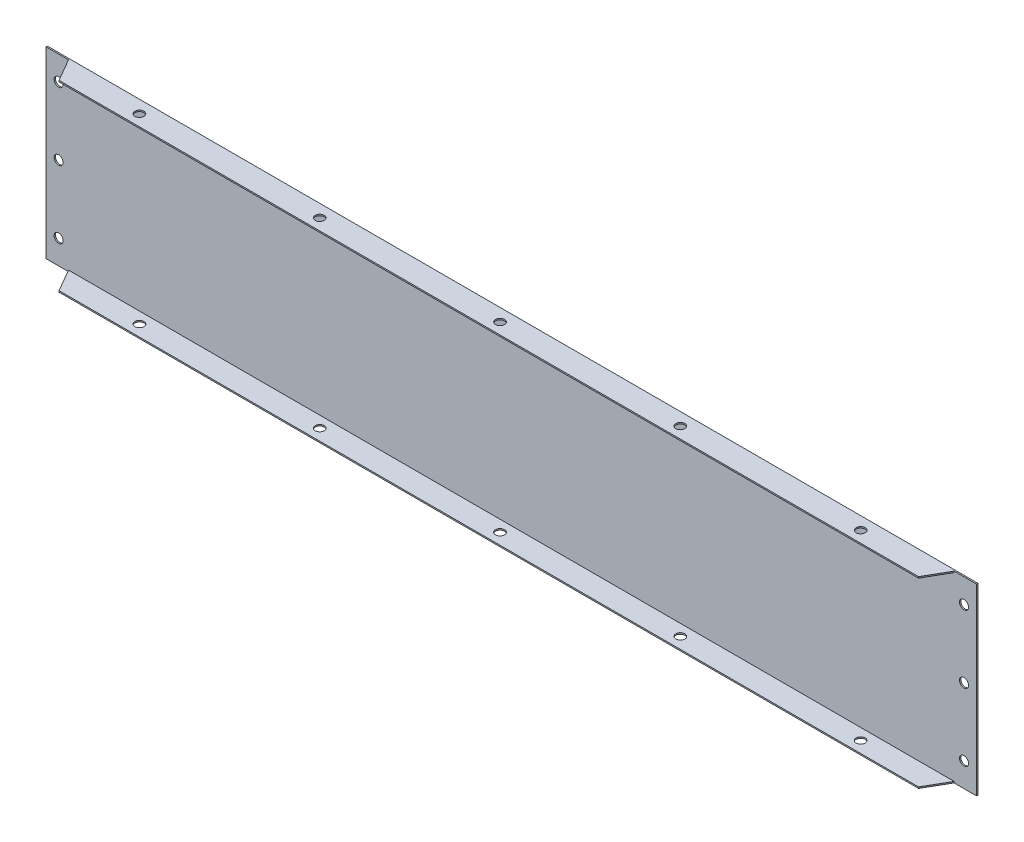
ISO-10303-21;
HEADER;
FILE_DESCRIPTION(('STEP AP214'),'2;1');
FILE_NAME('part.step','',(''),(''),'','','');
FILE_SCHEMA(('AUTOMOTIVE_DESIGN { 1 0 10303 214 1 1 1 1 }'));
ENDSEC;
DATA;
#1=APPLICATION_CONTEXT('core data for automotive mechanical design processes');
#2=APPLICATION_PROTOCOL_DEFINITION('international standard','automotive_design',2000,#1);
#3=PRODUCT_CONTEXT('',#1,'mechanical');
#4=PRODUCT('Part','Part','',(#3));
#5=PRODUCT_RELATED_PRODUCT_CATEGORY('part','',(#4));
#6=PRODUCT_DEFINITION_FORMATION('','',#4);
#7=PRODUCT_DEFINITION_CONTEXT('part definition',#1,'design');
#8=PRODUCT_DEFINITION('design','',#6,#7);
#9=PRODUCT_DEFINITION_SHAPE('','',#8);
#10=(LENGTH_UNIT() NAMED_UNIT(*) SI_UNIT(.MILLI.,.METRE.));
#11=(NAMED_UNIT(*) PLANE_ANGLE_UNIT() SI_UNIT($,.RADIAN.));
#12=(NAMED_UNIT(*) SI_UNIT($,.STERADIAN.) SOLID_ANGLE_UNIT());
#13=UNCERTAINTY_MEASURE_WITH_UNIT(LENGTH_MEASURE(1.E-05),#10,'distance_accuracy_value','');
#14=(GEOMETRIC_REPRESENTATION_CONTEXT(3) GLOBAL_UNCERTAINTY_ASSIGNED_CONTEXT((#13)) GLOBAL_UNIT_ASSIGNED_CONTEXT((#10,
#11,#12)) REPRESENTATION_CONTEXT('',''));
#15=CARTESIAN_POINT('',(0.,0.,0.));
#16=DIRECTION('',(0.,0.,1.));
#17=DIRECTION('',(1.,0.,0.));
#18=AXIS2_PLACEMENT_3D('',#15,#16,#17);
#19=CARTESIAN_POINT('',(447.55,0.,0.6));
#20=DIRECTION('',(1.,0.,0.));
#21=DIRECTION('',(0.,0.,-1.));
#22=AXIS2_PLACEMENT_3D('',#19,#20,#21);
#23=PLANE('',#22);
#24=DIRECTION('',(0.,-1.,0.));
#25=VECTOR('',#24,1.);
#26=CARTESIAN_POINT('',(447.55,0.,0.));
#27=LINE('',#26,#25);
#28=CARTESIAN_POINT('',(447.55,81.4,0.));
#29=VERTEX_POINT('',#28);
#30=CARTESIAN_POINT('',(447.55,0.,0.));
#31=VERTEX_POINT('',#30);
#32=EDGE_CURVE('E276',#29,#31,#27,.T.);
#33=ORIENTED_EDGE('',*,*,#32,.F.);
#34=DIRECTION('',(0.,0.,-1.));
#35=VECTOR('',#34,1.);
#36=CARTESIAN_POINT('',(447.55,81.4,0.6));
#37=LINE('',#36,#35);
#38=CARTESIAN_POINT('',(447.55,81.4,0.6));
#39=VERTEX_POINT('',#38);
#40=EDGE_CURVE('E11',#39,#29,#37,.T.);
#41=ORIENTED_EDGE('',*,*,#40,.F.);
#42=DIRECTION('',(0.,-1.,0.));
#43=VECTOR('',#42,1.);
#44=CARTESIAN_POINT('',(447.55,0.,0.6));
#45=LINE('',#44,#43);
#46=CARTESIAN_POINT('',(447.55,0.,0.6));
#47=VERTEX_POINT('',#46);
#48=EDGE_CURVE('E245',#39,#47,#45,.T.);
#49=ORIENTED_EDGE('',*,*,#48,.T.);
#50=DIRECTION('',(0.,0.,-1.));
#51=VECTOR('',#50,1.);
#52=CARTESIAN_POINT('',(447.55,0.,0.6));
#53=LINE('',#52,#51);
#54=EDGE_CURVE('E258',#47,#31,#53,.T.);
#55=ORIENTED_EDGE('',*,*,#54,.T.);
#56=EDGE_LOOP('',(#33,#41,#49,#55));
#57=FACE_BOUND('',#56,.T.);
#58=ADVANCED_FACE('F43',(#57),#23,.T.);
#59=CARTESIAN_POINT('',(0.,81.4,0.6));
#60=DIRECTION('',(0.,1.,0.));
#61=DIRECTION('',(0.,0.,1.));
#62=AXIS2_PLACEMENT_3D('',#59,#60,#61);
#63=PLANE('',#62);
#64=DIRECTION('',(1.,0.,0.));
#65=VECTOR('',#64,1.);
#66=CARTESIAN_POINT('',(0.,81.4,0.));
#67=LINE('',#66,#65);
#68=CARTESIAN_POINT('',(34.65,81.4,0.));
#69=VERTEX_POINT('',#68);
#70=EDGE_CURVE('E279',#69,#29,#67,.T.);
#71=ORIENTED_EDGE('',*,*,#70,.F.);
#72=DIRECTION('',(0.,0.,-1.));
#73=VECTOR('',#72,1.);
#74=CARTESIAN_POINT('',(34.65,81.4,0.6));
#75=LINE('',#74,#73);
#76=CARTESIAN_POINT('',(34.65,81.4,0.6));
#77=VERTEX_POINT('',#76);
#78=EDGE_CURVE('E51',#77,#69,#75,.T.);
#79=ORIENTED_EDGE('',*,*,#78,.F.);
#80=DIRECTION('',(1.,0.,0.));
#81=VECTOR('',#80,1.);
#82=CARTESIAN_POINT('',(0.,81.4,0.6));
#83=LINE('',#82,#81);
#84=CARTESIAN_POINT('',(44.65,81.4,0.6));
#85=VERTEX_POINT('',#84);
#86=EDGE_CURVE('E249',#77,#85,#83,.T.);
#87=ORIENTED_EDGE('',*,*,#86,.T.);
#88=DIRECTION('',(0.500000000000006,0.,0.866025403784435));
#89=VECTOR('',#88,1.);
#90=CARTESIAN_POINT('',(44.65,81.4,0.6));
#91=LINE('',#90,#89);
#92=CARTESIAN_POINT('',(50.4235026918964,81.4,10.6000000000001));
#93=VERTEX_POINT('',#92);
#94=EDGE_CURVE('E193',#85,#93,#91,.T.);
#95=ORIENTED_EDGE('',*,*,#94,.T.);
#96=DIRECTION('',(1.,0.,0.));
#97=VECTOR('',#96,1.);
#98=CARTESIAN_POINT('',(50.4235026918964,81.4,10.6000000000001));
#99=LINE('',#98,#97);
#100=CARTESIAN_POINT('',(431.776497308104,81.4,10.6));
#101=VERTEX_POINT('',#100);
#102=EDGE_CURVE('E212',#93,#101,#99,.T.);
#103=ORIENTED_EDGE('',*,*,#102,.T.);
#104=DIRECTION('',(0.500000000000004,0.,-0.866025403784436));
#105=VECTOR('',#104,1.);
#106=CARTESIAN_POINT('',(431.776497308104,81.4,10.6));
#107=LINE('',#106,#105);
#108=CARTESIAN_POINT('',(437.55,81.4,0.599999999999976));
#109=VERTEX_POINT('',#108);
#110=EDGE_CURVE('E200',#101,#109,#107,.T.);
#111=ORIENTED_EDGE('',*,*,#110,.T.);
#112=EDGE_CURVE('E248',#109,#39,#83,.T.);
#113=ORIENTED_EDGE('',*,*,#112,.T.);
#114=ORIENTED_EDGE('',*,*,#40,.T.);
#115=EDGE_LOOP('',(#71,#79,#87,#95,#103,#111,#113,#114));
#116=FACE_BOUND('',#115,.T.);
#117=CARTESIAN_POINT('',(81.1,81.4,5.60000000000224));
#118=DIRECTION('',(0.,1.,0.));
#119=DIRECTION('',(-1.,0.,0.));
#120=AXIS2_PLACEMENT_3D('',#117,#118,#119);
#121=CIRCLE('',#120,2.);
#122=CARTESIAN_POINT('',(79.1,81.4,5.60000000000224));
#123=VERTEX_POINT('',#122);
#124=EDGE_CURVE('E163',#123,#123,#121,.T.);
#125=ORIENTED_EDGE('',*,*,#124,.F.);
#126=EDGE_LOOP('',(#125));
#127=FACE_BOUND('',#126,.T.);
#128=CARTESIAN_POINT('',(161.1,81.4,5.60000000000168));
#129=DIRECTION('',(0.,1.,0.));
#130=DIRECTION('',(-1.,0.,0.));
#131=AXIS2_PLACEMENT_3D('',#128,#129,#130);
#132=CIRCLE('',#131,2.);
#133=CARTESIAN_POINT('',(159.1,81.4,5.60000000000168));
#134=VERTEX_POINT('',#133);
#135=EDGE_CURVE('E169',#134,#134,#132,.T.);
#136=ORIENTED_EDGE('',*,*,#135,.F.);
#137=EDGE_LOOP('',(#136));
#138=FACE_BOUND('',#137,.T.);
#139=CARTESIAN_POINT('',(241.1,81.4,5.60000000000112));
#140=DIRECTION('',(0.,1.,0.));
#141=DIRECTION('',(-1.,0.,0.));
#142=AXIS2_PLACEMENT_3D('',#139,#140,#141);
#143=CIRCLE('',#142,2.);
#144=CARTESIAN_POINT('',(239.1,81.4,5.60000000000112));
#145=VERTEX_POINT('',#144);
#146=EDGE_CURVE('E175',#145,#145,#143,.T.);
#147=ORIENTED_EDGE('',*,*,#146,.F.);
#148=EDGE_LOOP('',(#147));
#149=FACE_BOUND('',#148,.T.);
#150=CARTESIAN_POINT('',(321.1,81.4,5.60000000000056));
#151=DIRECTION('',(0.,1.,0.));
#152=DIRECTION('',(-1.,0.,0.));
#153=AXIS2_PLACEMENT_3D('',#150,#151,#152);
#154=CIRCLE('',#153,2.);
#155=CARTESIAN_POINT('',(319.1,81.4,5.60000000000056));
#156=VERTEX_POINT('',#155);
#157=EDGE_CURVE('E181',#156,#156,#154,.T.);
#158=ORIENTED_EDGE('',*,*,#157,.F.);
#159=EDGE_LOOP('',(#158));
#160=FACE_BOUND('',#159,.T.);
#161=CARTESIAN_POINT('',(401.1,81.4,5.6));
#162=DIRECTION('',(0.,1.,0.));
#163=DIRECTION('',(-1.,0.,0.));
#164=AXIS2_PLACEMENT_3D('',#161,#162,#163);
#165=CIRCLE('',#164,2.);
#166=CARTESIAN_POINT('',(399.1,81.4,5.6));
#167=VERTEX_POINT('',#166);
#168=EDGE_CURVE('E187',#167,#167,#165,.T.);
#169=ORIENTED_EDGE('',*,*,#168,.F.);
#170=EDGE_LOOP('',(#169));
#171=FACE_BOUND('',#170,.T.);
#172=ADVANCED_FACE('F300',(#116,#127,#138,#149,#160,#171),#63,.T.);
#173=CARTESIAN_POINT('',(34.65,0.,0.6));
#174=DIRECTION('',(1.,0.,0.));
#175=DIRECTION('',(0.,0.,-1.));
#176=AXIS2_PLACEMENT_3D('',#173,#174,#175);
#177=PLANE('',#176);
#178=DIRECTION('',(0.,-1.,0.));
#179=VECTOR('',#178,1.);
#180=CARTESIAN_POINT('',(34.65,0.,0.));
#181=LINE('',#180,#179);
#182=CARTESIAN_POINT('',(34.65,0.,0.));
#183=VERTEX_POINT('',#182);
#184=EDGE_CURVE('E282',#69,#183,#181,.T.);
#185=ORIENTED_EDGE('',*,*,#184,.T.);
#186=DIRECTION('',(0.,0.,-1.));
#187=VECTOR('',#186,1.);
#188=CARTESIAN_POINT('',(34.65,0.,0.6));
#189=LINE('',#188,#187);
#190=CARTESIAN_POINT('',(34.65,0.,0.6));
#191=VERTEX_POINT('',#190);
#192=EDGE_CURVE('E288',#191,#183,#189,.T.);
#193=ORIENTED_EDGE('',*,*,#192,.F.);
#194=DIRECTION('',(0.,-1.,0.));
#195=VECTOR('',#194,1.);
#196=CARTESIAN_POINT('',(34.65,0.,0.6));
#197=LINE('',#196,#195);
#198=EDGE_CURVE('E252',#77,#191,#197,.T.);
#199=ORIENTED_EDGE('',*,*,#198,.F.);
#200=ORIENTED_EDGE('',*,*,#78,.T.);
#201=EDGE_LOOP('',(#185,#193,#199,#200));
#202=FACE_BOUND('',#201,.T.);
#203=ADVANCED_FACE('F293',(#202),#177,.F.);
#204=CARTESIAN_POINT('',(40.25,70.7,0.6));
#205=DIRECTION('',(0.,0.,-1.));
#206=DIRECTION('',(-1.,0.,0.));
#207=AXIS2_PLACEMENT_3D('',#204,#205,#206);
#208=CYLINDRICAL_SURFACE('',#207,2.);
#209=CARTESIAN_POINT('',(40.25,70.7,0.6));
#210=DIRECTION('',(0.,0.,1.));
#211=DIRECTION('',(1.,0.,0.));
#212=AXIS2_PLACEMENT_3D('',#209,#210,#211);
#213=CIRCLE('',#212,2.);
#214=CARTESIAN_POINT('',(42.25,70.7,0.6));
#215=VERTEX_POINT('',#214);
#216=EDGE_CURVE('E242',#215,#215,#213,.T.);
#217=ORIENTED_EDGE('',*,*,#216,.T.);
#218=EDGE_LOOP('',(#217));
#219=FACE_BOUND('',#218,.T.);
#220=CARTESIAN_POINT('',(40.25,70.7,0.));
#221=DIRECTION('',(0.,0.,1.));
#222=DIRECTION('',(1.,0.,0.));
#223=AXIS2_PLACEMENT_3D('',#220,#221,#222);
#224=CIRCLE('',#223,2.);
#225=CARTESIAN_POINT('',(42.25,70.7,0.));
#226=VERTEX_POINT('',#225);
#227=EDGE_CURVE('E273',#226,#226,#224,.T.);
#228=ORIENTED_EDGE('',*,*,#227,.F.);
#229=EDGE_LOOP('',(#228));
#230=FACE_BOUND('',#229,.T.);
#231=ADVANCED_FACE('F350',(#219,#230),#208,.F.);
#232=CARTESIAN_POINT('',(441.95,70.7,0.6));
#233=DIRECTION('',(0.,0.,-1.));
#234=DIRECTION('',(-1.,0.,0.));
#235=AXIS2_PLACEMENT_3D('',#232,#233,#234);
#236=CYLINDRICAL_SURFACE('',#235,2.);
#237=CARTESIAN_POINT('',(441.95,70.7,0.6));
#238=DIRECTION('',(0.,0.,1.));
#239=DIRECTION('',(1.,0.,0.));
#240=AXIS2_PLACEMENT_3D('',#237,#238,#239);
#241=CIRCLE('',#240,2.);
#242=CARTESIAN_POINT('',(443.95,70.7,0.6));
#243=VERTEX_POINT('',#242);
#244=EDGE_CURVE('E239',#243,#243,#241,.T.);
#245=ORIENTED_EDGE('',*,*,#244,.T.);
#246=EDGE_LOOP('',(#245));
#247=FACE_BOUND('',#246,.T.);
#248=CARTESIAN_POINT('',(441.95,70.7,0.));
#249=DIRECTION('',(0.,0.,1.));
#250=DIRECTION('',(1.,0.,0.));
#251=AXIS2_PLACEMENT_3D('',#248,#249,#250);
#252=CIRCLE('',#251,2.);
#253=CARTESIAN_POINT('',(443.95,70.7,0.));
#254=VERTEX_POINT('',#253);
#255=EDGE_CURVE('E270',#254,#254,#252,.T.);
#256=ORIENTED_EDGE('',*,*,#255,.F.);
#257=EDGE_LOOP('',(#256));
#258=FACE_BOUND('',#257,.T.);
#259=ADVANCED_FACE('F353',(#247,#258),#236,.F.);
#260=CARTESIAN_POINT('',(441.95,10.7,0.6));
#261=DIRECTION('',(0.,0.,-1.));
#262=DIRECTION('',(-1.,0.,0.));
#263=AXIS2_PLACEMENT_3D('',#260,#261,#262);
#264=CYLINDRICAL_SURFACE('',#263,2.);
#265=CARTESIAN_POINT('',(441.95,10.7,0.6));
#266=DIRECTION('',(0.,0.,1.));
#267=DIRECTION('',(1.,0.,0.));
#268=AXIS2_PLACEMENT_3D('',#265,#266,#267);
#269=CIRCLE('',#268,2.);
#270=CARTESIAN_POINT('',(443.95,10.7,0.6));
#271=VERTEX_POINT('',#270);
#272=EDGE_CURVE('E236',#271,#271,#269,.T.);
#273=ORIENTED_EDGE('',*,*,#272,.T.);
#274=EDGE_LOOP('',(#273));
#275=FACE_BOUND('',#274,.T.);
#276=CARTESIAN_POINT('',(441.95,10.7,0.));
#277=DIRECTION('',(0.,0.,1.));
#278=DIRECTION('',(1.,0.,0.));
#279=AXIS2_PLACEMENT_3D('',#276,#277,#278);
#280=CIRCLE('',#279,2.);
#281=CARTESIAN_POINT('',(443.95,10.7,0.));
#282=VERTEX_POINT('',#281);
#283=EDGE_CURVE('E267',#282,#282,#280,.T.);
#284=ORIENTED_EDGE('',*,*,#283,.F.);
#285=EDGE_LOOP('',(#284));
#286=FACE_BOUND('',#285,.T.);
#287=ADVANCED_FACE('F357',(#275,#286),#264,.F.);
#288=CARTESIAN_POINT('',(40.25,10.7,0.6));
#289=DIRECTION('',(0.,0.,-1.));
#290=DIRECTION('',(-1.,0.,0.));
#291=AXIS2_PLACEMENT_3D('',#288,#289,#290);
#292=CYLINDRICAL_SURFACE('',#291,2.);
#293=CARTESIAN_POINT('',(40.25,10.7,0.6));
#294=DIRECTION('',(0.,0.,1.));
#295=DIRECTION('',(1.,0.,0.));
#296=AXIS2_PLACEMENT_3D('',#293,#294,#295);
#297=CIRCLE('',#296,2.);
#298=CARTESIAN_POINT('',(42.25,10.7,0.6));
#299=VERTEX_POINT('',#298);
#300=EDGE_CURVE('E233',#299,#299,#297,.T.);
#301=ORIENTED_EDGE('',*,*,#300,.T.);
#302=EDGE_LOOP('',(#301));
#303=FACE_BOUND('',#302,.T.);
#304=CARTESIAN_POINT('',(40.25,10.7,0.));
#305=DIRECTION('',(0.,0.,1.));
#306=DIRECTION('',(1.,0.,0.));
#307=AXIS2_PLACEMENT_3D('',#304,#305,#306);
#308=CIRCLE('',#307,2.);
#309=CARTESIAN_POINT('',(42.25,10.7,0.));
#310=VERTEX_POINT('',#309);
#311=EDGE_CURVE('E264',#310,#310,#308,.T.);
#312=ORIENTED_EDGE('',*,*,#311,.F.);
#313=EDGE_LOOP('',(#312));
#314=FACE_BOUND('',#313,.T.);
#315=ADVANCED_FACE('F361',(#303,#314),#292,.F.);
#316=CARTESIAN_POINT('',(40.25,40.7,0.6));
#317=DIRECTION('',(0.,0.,-1.));
#318=DIRECTION('',(-1.,0.,0.));
#319=AXIS2_PLACEMENT_3D('',#316,#317,#318);
#320=CYLINDRICAL_SURFACE('',#319,2.);
#321=CARTESIAN_POINT('',(40.25,40.7,0.6));
#322=DIRECTION('',(0.,0.,1.));
#323=DIRECTION('',(1.,0.,0.));
#324=AXIS2_PLACEMENT_3D('',#321,#322,#323);
#325=CIRCLE('',#324,2.);
#326=CARTESIAN_POINT('',(42.25,40.7,0.6));
#327=VERTEX_POINT('',#326);
#328=EDGE_CURVE('E229',#327,#327,#325,.T.);
#329=ORIENTED_EDGE('',*,*,#328,.T.);
#330=EDGE_LOOP('',(#329));
#331=FACE_BOUND('',#330,.T.);
#332=CARTESIAN_POINT('',(40.25,40.7,0.));
#333=DIRECTION('',(0.,0.,1.));
#334=DIRECTION('',(1.,0.,0.));
#335=AXIS2_PLACEMENT_3D('',#332,#333,#334);
#336=CIRCLE('',#335,2.);
#337=CARTESIAN_POINT('',(42.25,40.7,0.));
#338=VERTEX_POINT('',#337);
#339=EDGE_CURVE('E261',#338,#338,#336,.T.);
#340=ORIENTED_EDGE('',*,*,#339,.F.);
#341=EDGE_LOOP('',(#340));
#342=FACE_BOUND('',#341,.T.);
#343=ADVANCED_FACE('F364',(#331,#342),#320,.F.);
#344=CARTESIAN_POINT('',(441.95,40.7,0.6));
#345=DIRECTION('',(0.,0.,-1.));
#346=DIRECTION('',(-1.,0.,0.));
#347=AXIS2_PLACEMENT_3D('',#344,#345,#346);
#348=CYLINDRICAL_SURFACE('',#347,2.);
#349=CARTESIAN_POINT('',(441.95,40.7,0.6));
#350=DIRECTION('',(0.,0.,1.));
#351=DIRECTION('',(1.,0.,0.));
#352=AXIS2_PLACEMENT_3D('',#349,#350,#351);
#353=CIRCLE('',#352,2.);
#354=CARTESIAN_POINT('',(443.95,40.7,0.6));
#355=VERTEX_POINT('',#354);
#356=EDGE_CURVE('E226',#355,#355,#353,.T.);
#357=ORIENTED_EDGE('',*,*,#356,.T.);
#358=EDGE_LOOP('',(#357));
#359=FACE_BOUND('',#358,.T.);
#360=CARTESIAN_POINT('',(441.95,40.7,0.));
#361=DIRECTION('',(0.,0.,1.));
#362=DIRECTION('',(1.,0.,0.));
#363=AXIS2_PLACEMENT_3D('',#360,#361,#362);
#364=CIRCLE('',#363,2.);
#365=CARTESIAN_POINT('',(443.95,40.7,0.));
#366=VERTEX_POINT('',#365);
#367=EDGE_CURVE('E219',#366,#366,#364,.T.);
#368=ORIENTED_EDGE('',*,*,#367,.F.);
#369=EDGE_LOOP('',(#368));
#370=FACE_BOUND('',#369,.T.);
#371=ADVANCED_FACE('F45',(#359,#370),#348,.F.);
#372=CARTESIAN_POINT('',(0.,0.,0.6));
#373=DIRECTION('',(0.,1.,0.));
#374=DIRECTION('',(0.,0.,1.));
#375=AXIS2_PLACEMENT_3D('',#372,#373,#374);
#376=PLANE('',#375);
#377=DIRECTION('',(1.,0.,0.));
#378=VECTOR('',#377,1.);
#379=CARTESIAN_POINT('',(0.,0.,0.));
#380=LINE('',#379,#378);
#381=EDGE_CURVE('E230',#183,#31,#380,.T.);
#382=ORIENTED_EDGE('',*,*,#381,.T.);
#383=ORIENTED_EDGE('',*,*,#54,.F.);
#384=DIRECTION('',(1.,0.,0.));
#385=VECTOR('',#384,1.);
#386=CARTESIAN_POINT('',(0.,0.,0.6));
#387=LINE('',#386,#385);
#388=CARTESIAN_POINT('',(437.55,0.,0.599999999999976));
#389=VERTEX_POINT('',#388);
#390=EDGE_CURVE('E255',#389,#47,#387,.T.);
#391=ORIENTED_EDGE('',*,*,#390,.F.);
#392=DIRECTION('',(-0.500000000000004,0.,0.866025403784436));
#393=VECTOR('',#392,1.);
#394=CARTESIAN_POINT('',(437.55,0.,0.599999999999976));
#395=LINE('',#394,#393);
#396=CARTESIAN_POINT('',(431.776497308104,0.,10.6));
#397=VERTEX_POINT('',#396);
#398=EDGE_CURVE('E159',#389,#397,#395,.T.);
#399=ORIENTED_EDGE('',*,*,#398,.T.);
#400=DIRECTION('',(-1.,0.,0.));
#401=VECTOR('',#400,1.);
#402=CARTESIAN_POINT('',(431.776497308104,0.,10.6));
#403=LINE('',#402,#401);
#404=CARTESIAN_POINT('',(50.4235026918964,0.,10.6000000000001));
#405=VERTEX_POINT('',#404);
#406=EDGE_CURVE('E136',#397,#405,#403,.T.);
#407=ORIENTED_EDGE('',*,*,#406,.T.);
#408=DIRECTION('',(-0.500000000000006,0.,-0.866025403784435));
#409=VECTOR('',#408,1.);
#410=CARTESIAN_POINT('',(50.4235026918964,0.,10.6000000000001));
#411=LINE('',#410,#409);
#412=CARTESIAN_POINT('',(44.65,0.,0.6));
#413=VERTEX_POINT('',#412);
#414=EDGE_CURVE('E156',#405,#413,#411,.T.);
#415=ORIENTED_EDGE('',*,*,#414,.T.);
#416=EDGE_CURVE('E256',#191,#413,#387,.T.);
#417=ORIENTED_EDGE('',*,*,#416,.F.);
#418=ORIENTED_EDGE('',*,*,#192,.T.);
#419=EDGE_LOOP('',(#382,#383,#391,#399,#407,#415,#417,#418));
#420=FACE_BOUND('',#419,.T.);
#421=CARTESIAN_POINT('',(81.1,0.,5.60000000000224));
#422=DIRECTION('',(0.,-1.,0.));
#423=DIRECTION('',(0.,0.,-1.));
#424=AXIS2_PLACEMENT_3D('',#421,#422,#423);
#425=CIRCLE('',#424,2.);
#426=CARTESIAN_POINT('',(81.1,0.,3.60000000000224));
#427=VERTEX_POINT('',#426);
#428=EDGE_CURVE('E617',#427,#427,#425,.T.);
#429=ORIENTED_EDGE('',*,*,#428,.F.);
#430=EDGE_LOOP('',(#429));
#431=FACE_BOUND('',#430,.T.);
#432=CARTESIAN_POINT('',(161.1,0.,5.60000000000168));
#433=DIRECTION('',(0.,-1.,0.));
#434=DIRECTION('',(0.,0.,-1.));
#435=AXIS2_PLACEMENT_3D('',#432,#433,#434);
#436=CIRCLE('',#435,2.);
#437=CARTESIAN_POINT('',(161.1,0.,3.60000000000168));
#438=VERTEX_POINT('',#437);
#439=EDGE_CURVE('E619',#438,#438,#436,.T.);
#440=ORIENTED_EDGE('',*,*,#439,.F.);
#441=EDGE_LOOP('',(#440));
#442=FACE_BOUND('',#441,.T.);
#443=CARTESIAN_POINT('',(241.1,0.,5.60000000000112));
#444=DIRECTION('',(0.,-1.,0.));
#445=DIRECTION('',(0.,0.,-1.));
#446=AXIS2_PLACEMENT_3D('',#443,#444,#445);
#447=CIRCLE('',#446,2.);
#448=CARTESIAN_POINT('',(241.1,0.,3.60000000000113));
#449=VERTEX_POINT('',#448);
#450=EDGE_CURVE('E625',#449,#449,#447,.T.);
#451=ORIENTED_EDGE('',*,*,#450,.F.);
#452=EDGE_LOOP('',(#451));
#453=FACE_BOUND('',#452,.T.);
#454=CARTESIAN_POINT('',(321.1,0.,5.60000000000056));
#455=DIRECTION('',(0.,-1.,0.));
#456=DIRECTION('',(0.,0.,-1.));
#457=AXIS2_PLACEMENT_3D('',#454,#455,#456);
#458=CIRCLE('',#457,2.);
#459=CARTESIAN_POINT('',(321.1,0.,3.60000000000057));
#460=VERTEX_POINT('',#459);
#461=EDGE_CURVE('E631',#460,#460,#458,.T.);
#462=ORIENTED_EDGE('',*,*,#461,.F.);
#463=EDGE_LOOP('',(#462));
#464=FACE_BOUND('',#463,.T.);
#465=CARTESIAN_POINT('',(401.1,0.,5.6));
#466=DIRECTION('',(0.,-1.,0.));
#467=DIRECTION('',(0.,0.,-1.));
#468=AXIS2_PLACEMENT_3D('',#465,#466,#467);
#469=CIRCLE('',#468,2.);
#470=CARTESIAN_POINT('',(401.1,0.,3.60000000000001));
#471=VERTEX_POINT('',#470);
#472=EDGE_CURVE('E637',#471,#471,#469,.T.);
#473=ORIENTED_EDGE('',*,*,#472,.F.);
#474=EDGE_LOOP('',(#473));
#475=FACE_BOUND('',#474,.T.);
#476=ADVANCED_FACE('F309',(#420,#431,#442,#453,#464,#475),#376,.F.);
#477=CARTESIAN_POINT('',(0.,0.,0.6));
#478=DIRECTION('',(0.,0.,1.));
#479=DIRECTION('',(1.,0.,0.));
#480=AXIS2_PLACEMENT_3D('',#477,#478,#479);
#481=PLANE('',#480);
#482=DIRECTION('',(0.,-1.,0.));
#483=VECTOR('',#482,1.);
#484=CARTESIAN_POINT('',(44.65,0.6,0.6));
#485=LINE('',#484,#483);
#486=CARTESIAN_POINT('',(44.65,0.6,0.6));
#487=VERTEX_POINT('',#486);
#488=EDGE_CURVE('E63',#487,#413,#485,.T.);
#489=ORIENTED_EDGE('',*,*,#488,.F.);
#490=DIRECTION('',(1.,0.,0.));
#491=VECTOR('',#490,1.);
#492=CARTESIAN_POINT('',(44.65,0.6,0.6));
#493=LINE('',#492,#491);
#494=CARTESIAN_POINT('',(437.55,0.6,0.6));
#495=VERTEX_POINT('',#494);
#496=EDGE_CURVE('E58',#487,#495,#493,.T.);
#497=ORIENTED_EDGE('',*,*,#496,.T.);
#498=DIRECTION('',(0.,-1.,0.));
#499=VECTOR('',#498,1.);
#500=CARTESIAN_POINT('',(437.55,0.6,0.599999999999976));
#501=LINE('',#500,#499);
#502=EDGE_CURVE('E141',#495,#389,#501,.T.);
#503=ORIENTED_EDGE('',*,*,#502,.T.);
#504=ORIENTED_EDGE('',*,*,#390,.T.);
#505=ORIENTED_EDGE('',*,*,#48,.F.);
#506=ORIENTED_EDGE('',*,*,#112,.F.);
#507=DIRECTION('',(0.,1.,0.));
#508=VECTOR('',#507,1.);
#509=CARTESIAN_POINT('',(437.55,80.8,0.599999999999976));
#510=LINE('',#509,#508);
#511=CARTESIAN_POINT('',(437.55,80.8,0.599999999999976));
#512=VERTEX_POINT('',#511);
#513=EDGE_CURVE('E217',#512,#109,#510,.T.);
#514=ORIENTED_EDGE('',*,*,#513,.F.);
#515=DIRECTION('',(-1.,0.,0.));
#516=VECTOR('',#515,1.);
#517=CARTESIAN_POINT('',(437.55,80.8,0.599999999999976));
#518=LINE('',#517,#516);
#519=CARTESIAN_POINT('',(44.65,80.8,0.6));
#520=VERTEX_POINT('',#519);
#521=EDGE_CURVE('E196',#512,#520,#518,.T.);
#522=ORIENTED_EDGE('',*,*,#521,.T.);
#523=DIRECTION('',(0.,1.,0.));
#524=VECTOR('',#523,1.);
#525=CARTESIAN_POINT('',(44.65,80.8,0.6));
#526=LINE('',#525,#524);
#527=EDGE_CURVE('E209',#520,#85,#526,.T.);
#528=ORIENTED_EDGE('',*,*,#527,.T.);
#529=ORIENTED_EDGE('',*,*,#86,.F.);
#530=ORIENTED_EDGE('',*,*,#198,.T.);
#531=ORIENTED_EDGE('',*,*,#416,.T.);
#532=EDGE_LOOP('',(#489,#497,#503,#504,#505,#506,#514,#522,#528,#529,#530,#531));
#533=FACE_BOUND('',#532,.T.);
#534=ORIENTED_EDGE('',*,*,#356,.F.);
#535=EDGE_LOOP('',(#534));
#536=FACE_BOUND('',#535,.T.);
#537=ORIENTED_EDGE('',*,*,#328,.F.);
#538=EDGE_LOOP('',(#537));
#539=FACE_BOUND('',#538,.T.);
#540=ORIENTED_EDGE('',*,*,#300,.F.);
#541=EDGE_LOOP('',(#540));
#542=FACE_BOUND('',#541,.T.);
#543=ORIENTED_EDGE('',*,*,#272,.F.);
#544=EDGE_LOOP('',(#543));
#545=FACE_BOUND('',#544,.T.);
#546=ORIENTED_EDGE('',*,*,#244,.F.);
#547=EDGE_LOOP('',(#546));
#548=FACE_BOUND('',#547,.T.);
#549=ORIENTED_EDGE('',*,*,#216,.F.);
#550=EDGE_LOOP('',(#549));
#551=FACE_BOUND('',#550,.T.);
#552=ADVANCED_FACE('F312',(#533,#536,#539,#542,#545,#548,#551),#481,.T.);
#553=CARTESIAN_POINT('',(0.,0.,0.));
#554=DIRECTION('',(0.,0.,1.));
#555=DIRECTION('',(1.,0.,0.));
#556=AXIS2_PLACEMENT_3D('',#553,#554,#555);
#557=PLANE('',#556);
#558=ORIENTED_EDGE('',*,*,#367,.T.);
#559=EDGE_LOOP('',(#558));
#560=FACE_BOUND('',#559,.T.);
#561=ORIENTED_EDGE('',*,*,#339,.T.);
#562=EDGE_LOOP('',(#561));
#563=FACE_BOUND('',#562,.T.);
#564=ORIENTED_EDGE('',*,*,#311,.T.);
#565=EDGE_LOOP('',(#564));
#566=FACE_BOUND('',#565,.T.);
#567=ORIENTED_EDGE('',*,*,#283,.T.);
#568=EDGE_LOOP('',(#567));
#569=FACE_BOUND('',#568,.T.);
#570=ORIENTED_EDGE('',*,*,#255,.T.);
#571=EDGE_LOOP('',(#570));
#572=FACE_BOUND('',#571,.T.);
#573=ORIENTED_EDGE('',*,*,#227,.T.);
#574=EDGE_LOOP('',(#573));
#575=FACE_BOUND('',#574,.T.);
#576=ORIENTED_EDGE('',*,*,#32,.T.);
#577=ORIENTED_EDGE('',*,*,#381,.F.);
#578=ORIENTED_EDGE('',*,*,#184,.F.);
#579=ORIENTED_EDGE('',*,*,#70,.T.);
#580=EDGE_LOOP('',(#576,#577,#578,#579));
#581=FACE_BOUND('',#580,.T.);
#582=ADVANCED_FACE('F299',(#560,#563,#566,#569,#572,#575,#581),#557,.F.);
#583=CARTESIAN_POINT('',(431.776497308104,80.8,10.6));
#584=DIRECTION('',(0.866025403784436,0.,0.500000000000004));
#585=DIRECTION('',(0.500000000000004,0.,-0.866025403784436));
#586=AXIS2_PLACEMENT_3D('',#583,#584,#585);
#587=PLANE('',#586);
#588=ORIENTED_EDGE('',*,*,#110,.F.);
#589=DIRECTION('',(0.,1.,0.));
#590=VECTOR('',#589,1.);
#591=CARTESIAN_POINT('',(431.776497308104,80.8,10.6));
#592=LINE('',#591,#590);
#593=CARTESIAN_POINT('',(431.776497308104,80.8,10.6));
#594=VERTEX_POINT('',#593);
#595=EDGE_CURVE('E220',#594,#101,#592,.T.);
#596=ORIENTED_EDGE('',*,*,#595,.F.);
#597=DIRECTION('',(0.500000000000004,0.,-0.866025403784436));
#598=VECTOR('',#597,1.);
#599=CARTESIAN_POINT('',(431.776497308104,80.8,10.6));
#600=LINE('',#599,#598);
#601=EDGE_CURVE('E206',#594,#512,#600,.T.);
#602=ORIENTED_EDGE('',*,*,#601,.T.);
#603=ORIENTED_EDGE('',*,*,#513,.T.);
#604=EDGE_LOOP('',(#588,#596,#602,#603));
#605=FACE_BOUND('',#604,.T.);
#606=ADVANCED_FACE('F324',(#605),#587,.T.);
#607=CARTESIAN_POINT('',(50.4235026918964,80.8,10.6000000000001));
#608=DIRECTION('',(0.,0.,1.));
#609=DIRECTION('',(1.,0.,0.));
#610=AXIS2_PLACEMENT_3D('',#607,#608,#609);
#611=PLANE('',#610);
#612=ORIENTED_EDGE('',*,*,#102,.F.);
#613=DIRECTION('',(0.,1.,0.));
#614=VECTOR('',#613,1.);
#615=CARTESIAN_POINT('',(50.4235026918964,80.8,10.6000000000001));
#616=LINE('',#615,#614);
#617=CARTESIAN_POINT('',(50.4235026918964,80.8,10.6000000000001));
#618=VERTEX_POINT('',#617);
#619=EDGE_CURVE('E222',#618,#93,#616,.T.);
#620=ORIENTED_EDGE('',*,*,#619,.F.);
#621=DIRECTION('',(1.,0.,0.));
#622=VECTOR('',#621,1.);
#623=CARTESIAN_POINT('',(50.4235026918964,80.8,10.6000000000001));
#624=LINE('',#623,#622);
#625=EDGE_CURVE('E203',#618,#594,#624,.T.);
#626=ORIENTED_EDGE('',*,*,#625,.T.);
#627=ORIENTED_EDGE('',*,*,#595,.T.);
#628=EDGE_LOOP('',(#612,#620,#626,#627));
#629=FACE_BOUND('',#628,.T.);
#630=ADVANCED_FACE('F321',(#629),#611,.T.);
#631=CARTESIAN_POINT('',(44.65,80.8,0.6));
#632=DIRECTION('',(-0.866025403784435,0.,0.500000000000006));
#633=DIRECTION('',(0.500000000000006,0.,0.866025403784435));
#634=AXIS2_PLACEMENT_3D('',#631,#632,#633);
#635=PLANE('',#634);
#636=ORIENTED_EDGE('',*,*,#94,.F.);
#637=ORIENTED_EDGE('',*,*,#527,.F.);
#638=DIRECTION('',(0.500000000000006,0.,0.866025403784435));
#639=VECTOR('',#638,1.);
#640=CARTESIAN_POINT('',(44.65,80.8,0.6));
#641=LINE('',#640,#639);
#642=EDGE_CURVE('E199',#520,#618,#641,.T.);
#643=ORIENTED_EDGE('',*,*,#642,.T.);
#644=ORIENTED_EDGE('',*,*,#619,.T.);
#645=EDGE_LOOP('',(#636,#637,#643,#644));
#646=FACE_BOUND('',#645,.T.);
#647=ADVANCED_FACE('F317',(#646),#635,.T.);
#648=CARTESIAN_POINT('',(0.,80.8,0.));
#649=DIRECTION('',(0.,1.,0.));
#650=DIRECTION('',(-1.,0.,0.));
#651=AXIS2_PLACEMENT_3D('',#648,#649,#650);
#652=PLANE('',#651);
#653=CARTESIAN_POINT('',(81.1,80.8,5.60000000000224));
#654=DIRECTION('',(0.,1.,0.));
#655=DIRECTION('',(-1.,0.,0.));
#656=AXIS2_PLACEMENT_3D('',#653,#654,#655);
#657=CIRCLE('',#656,2.);
#658=CARTESIAN_POINT('',(79.1,80.8,5.60000000000224));
#659=VERTEX_POINT('',#658);
#660=EDGE_CURVE('E166',#659,#659,#657,.T.);
#661=ORIENTED_EDGE('',*,*,#660,.T.);
#662=EDGE_LOOP('',(#661));
#663=FACE_BOUND('',#662,.T.);
#664=CARTESIAN_POINT('',(161.1,80.8,5.60000000000168));
#665=DIRECTION('',(0.,1.,0.));
#666=DIRECTION('',(-1.,0.,0.));
#667=AXIS2_PLACEMENT_3D('',#664,#665,#666);
#668=CIRCLE('',#667,2.);
#669=CARTESIAN_POINT('',(159.1,80.8,5.60000000000168));
#670=VERTEX_POINT('',#669);
#671=EDGE_CURVE('E172',#670,#670,#668,.T.);
#672=ORIENTED_EDGE('',*,*,#671,.T.);
#673=EDGE_LOOP('',(#672));
#674=FACE_BOUND('',#673,.T.);
#675=CARTESIAN_POINT('',(241.1,80.8,5.60000000000112));
#676=DIRECTION('',(0.,1.,0.));
#677=DIRECTION('',(-1.,0.,0.));
#678=AXIS2_PLACEMENT_3D('',#675,#676,#677);
#679=CIRCLE('',#678,2.);
#680=CARTESIAN_POINT('',(239.1,80.8,5.60000000000112));
#681=VERTEX_POINT('',#680);
#682=EDGE_CURVE('E178',#681,#681,#679,.T.);
#683=ORIENTED_EDGE('',*,*,#682,.T.);
#684=EDGE_LOOP('',(#683));
#685=FACE_BOUND('',#684,.T.);
#686=CARTESIAN_POINT('',(321.1,80.8,5.60000000000056));
#687=DIRECTION('',(0.,1.,0.));
#688=DIRECTION('',(-1.,0.,0.));
#689=AXIS2_PLACEMENT_3D('',#686,#687,#688);
#690=CIRCLE('',#689,2.);
#691=CARTESIAN_POINT('',(319.1,80.8,5.60000000000056));
#692=VERTEX_POINT('',#691);
#693=EDGE_CURVE('E184',#692,#692,#690,.T.);
#694=ORIENTED_EDGE('',*,*,#693,.T.);
#695=EDGE_LOOP('',(#694));
#696=FACE_BOUND('',#695,.T.);
#697=CARTESIAN_POINT('',(401.1,80.8,5.6));
#698=DIRECTION('',(0.,1.,0.));
#699=DIRECTION('',(-1.,0.,0.));
#700=AXIS2_PLACEMENT_3D('',#697,#698,#699);
#701=CIRCLE('',#700,2.);
#702=CARTESIAN_POINT('',(399.1,80.8,5.6));
#703=VERTEX_POINT('',#702);
#704=EDGE_CURVE('E190',#703,#703,#701,.T.);
#705=ORIENTED_EDGE('',*,*,#704,.T.);
#706=EDGE_LOOP('',(#705));
#707=FACE_BOUND('',#706,.T.);
#708=ORIENTED_EDGE('',*,*,#521,.F.);
#709=ORIENTED_EDGE('',*,*,#601,.F.);
#710=ORIENTED_EDGE('',*,*,#625,.F.);
#711=ORIENTED_EDGE('',*,*,#642,.F.);
#712=EDGE_LOOP('',(#708,#709,#710,#711));
#713=FACE_BOUND('',#712,.T.);
#714=ADVANCED_FACE('F327',(#663,#674,#685,#696,#707,#713),#652,.F.);
#715=CARTESIAN_POINT('',(401.1,80.8,5.6));
#716=DIRECTION('',(0.,1.,0.));
#717=DIRECTION('',(-1.,0.,0.));
#718=AXIS2_PLACEMENT_3D('',#715,#716,#717);
#719=CYLINDRICAL_SURFACE('',#718,2.);
#720=ORIENTED_EDGE('',*,*,#704,.F.);
#721=EDGE_LOOP('',(#720));
#722=FACE_BOUND('',#721,.T.);
#723=ORIENTED_EDGE('',*,*,#168,.T.);
#724=EDGE_LOOP('',(#723));
#725=FACE_BOUND('',#724,.T.);
#726=ADVANCED_FACE('F329',(#722,#725),#719,.F.);
#727=CARTESIAN_POINT('',(321.1,80.8,5.60000000000056));
#728=DIRECTION('',(0.,1.,0.));
#729=DIRECTION('',(-1.,0.,0.));
#730=AXIS2_PLACEMENT_3D('',#727,#728,#729);
#731=CYLINDRICAL_SURFACE('',#730,2.);
#732=ORIENTED_EDGE('',*,*,#693,.F.);
#733=EDGE_LOOP('',(#732));
#734=FACE_BOUND('',#733,.T.);
#735=ORIENTED_EDGE('',*,*,#157,.T.);
#736=EDGE_LOOP('',(#735));
#737=FACE_BOUND('',#736,.T.);
#738=ADVANCED_FACE('F336',(#734,#737),#731,.F.);
#739=CARTESIAN_POINT('',(241.1,80.8,5.60000000000112));
#740=DIRECTION('',(0.,1.,0.));
#741=DIRECTION('',(-1.,0.,0.));
#742=AXIS2_PLACEMENT_3D('',#739,#740,#741);
#743=CYLINDRICAL_SURFACE('',#742,2.);
#744=ORIENTED_EDGE('',*,*,#682,.F.);
#745=EDGE_LOOP('',(#744));
#746=FACE_BOUND('',#745,.T.);
#747=ORIENTED_EDGE('',*,*,#146,.T.);
#748=EDGE_LOOP('',(#747));
#749=FACE_BOUND('',#748,.T.);
#750=ADVANCED_FACE('F480',(#746,#749),#743,.F.);
#751=CARTESIAN_POINT('',(161.1,80.8,5.60000000000168));
#752=DIRECTION('',(0.,1.,0.));
#753=DIRECTION('',(-1.,0.,0.));
#754=AXIS2_PLACEMENT_3D('',#751,#752,#753);
#755=CYLINDRICAL_SURFACE('',#754,2.);
#756=ORIENTED_EDGE('',*,*,#671,.F.);
#757=EDGE_LOOP('',(#756));
#758=FACE_BOUND('',#757,.T.);
#759=ORIENTED_EDGE('',*,*,#135,.T.);
#760=EDGE_LOOP('',(#759));
#761=FACE_BOUND('',#760,.T.);
#762=ADVANCED_FACE('F490',(#758,#761),#755,.F.);
#763=CARTESIAN_POINT('',(81.1,80.8,5.60000000000224));
#764=DIRECTION('',(0.,1.,0.));
#765=DIRECTION('',(-1.,0.,0.));
#766=AXIS2_PLACEMENT_3D('',#763,#764,#765);
#767=CYLINDRICAL_SURFACE('',#766,2.);
#768=ORIENTED_EDGE('',*,*,#660,.F.);
#769=EDGE_LOOP('',(#768));
#770=FACE_BOUND('',#769,.T.);
#771=ORIENTED_EDGE('',*,*,#124,.T.);
#772=EDGE_LOOP('',(#771));
#773=FACE_BOUND('',#772,.T.);
#774=ADVANCED_FACE('F500',(#770,#773),#767,.F.);
#775=CARTESIAN_POINT('',(50.4235026918964,0.6,10.6000000000001));
#776=DIRECTION('',(-0.866025403784435,0.,0.500000000000006));
#777=DIRECTION('',(0.500000000000006,0.,0.866025403784435));
#778=AXIS2_PLACEMENT_3D('',#775,#776,#777);
#779=PLANE('',#778);
#780=ORIENTED_EDGE('',*,*,#414,.F.);
#781=DIRECTION('',(0.,-1.,0.));
#782=VECTOR('',#781,1.);
#783=CARTESIAN_POINT('',(50.4235026918964,0.6,10.6000000000001));
#784=LINE('',#783,#782);
#785=CARTESIAN_POINT('',(50.4235026918964,0.6,10.6000000000001));
#786=VERTEX_POINT('',#785);
#787=EDGE_CURVE('E140',#786,#405,#784,.T.);
#788=ORIENTED_EDGE('',*,*,#787,.F.);
#789=DIRECTION('',(-0.500000000000006,0.,-0.866025403784435));
#790=VECTOR('',#789,1.);
#791=CARTESIAN_POINT('',(50.4235026918964,0.6,10.6000000000001));
#792=LINE('',#791,#790);
#793=EDGE_CURVE('E151',#786,#487,#792,.T.);
#794=ORIENTED_EDGE('',*,*,#793,.T.);
#795=ORIENTED_EDGE('',*,*,#488,.T.);
#796=EDGE_LOOP('',(#780,#788,#794,#795));
#797=FACE_BOUND('',#796,.T.);
#798=ADVANCED_FACE('F510',(#797),#779,.T.);
#799=CARTESIAN_POINT('',(431.776497308104,0.6,10.6));
#800=DIRECTION('',(0.,0.,1.));
#801=DIRECTION('',(1.,0.,0.));
#802=AXIS2_PLACEMENT_3D('',#799,#800,#801);
#803=PLANE('',#802);
#804=ORIENTED_EDGE('',*,*,#406,.F.);
#805=DIRECTION('',(0.,-1.,0.));
#806=VECTOR('',#805,1.);
#807=CARTESIAN_POINT('',(431.776497308104,0.6,10.6));
#808=LINE('',#807,#806);
#809=CARTESIAN_POINT('',(431.776497308104,0.6,10.6));
#810=VERTEX_POINT('',#809);
#811=EDGE_CURVE('E130',#810,#397,#808,.T.);
#812=ORIENTED_EDGE('',*,*,#811,.F.);
#813=DIRECTION('',(-1.,0.,0.));
#814=VECTOR('',#813,1.);
#815=CARTESIAN_POINT('',(431.776497308104,0.6,10.6));
#816=LINE('',#815,#814);
#817=EDGE_CURVE('E134',#810,#786,#816,.T.);
#818=ORIENTED_EDGE('',*,*,#817,.T.);
#819=ORIENTED_EDGE('',*,*,#787,.T.);
#820=EDGE_LOOP('',(#804,#812,#818,#819));
#821=FACE_BOUND('',#820,.T.);
#822=ADVANCED_FACE('F132',(#821),#803,.T.);
#823=CARTESIAN_POINT('',(437.55,0.6,0.599999999999976));
#824=DIRECTION('',(0.866025403784436,0.,0.500000000000004));
#825=DIRECTION('',(0.500000000000004,0.,-0.866025403784436));
#826=AXIS2_PLACEMENT_3D('',#823,#824,#825);
#827=PLANE('',#826);
#828=ORIENTED_EDGE('',*,*,#398,.F.);
#829=ORIENTED_EDGE('',*,*,#502,.F.);
#830=DIRECTION('',(-0.500000000000004,0.,0.866025403784436));
#831=VECTOR('',#830,1.);
#832=CARTESIAN_POINT('',(437.55,0.6,0.599999999999976));
#833=LINE('',#832,#831);
#834=EDGE_CURVE('E144',#495,#810,#833,.T.);
#835=ORIENTED_EDGE('',*,*,#834,.T.);
#836=ORIENTED_EDGE('',*,*,#811,.T.);
#837=EDGE_LOOP('',(#828,#829,#835,#836));
#838=FACE_BOUND('',#837,.T.);
#839=ADVANCED_FACE('F145',(#838),#827,.T.);
#840=CARTESIAN_POINT('',(0.,0.6,0.));
#841=DIRECTION('',(0.,-1.,0.));
#842=DIRECTION('',(0.,0.,-1.));
#843=AXIS2_PLACEMENT_3D('',#840,#841,#842);
#844=PLANE('',#843);
#845=CARTESIAN_POINT('',(81.1,0.6,5.60000000000224));
#846=DIRECTION('',(0.,-1.,0.));
#847=DIRECTION('',(0.,0.,-1.));
#848=AXIS2_PLACEMENT_3D('',#845,#846,#847);
#849=CIRCLE('',#848,2.);
#850=CARTESIAN_POINT('',(81.1,0.6,3.60000000000224));
#851=VERTEX_POINT('',#850);
#852=EDGE_CURVE('E614',#851,#851,#849,.T.);
#853=ORIENTED_EDGE('',*,*,#852,.T.);
#854=EDGE_LOOP('',(#853));
#855=FACE_BOUND('',#854,.T.);
#856=CARTESIAN_POINT('',(161.1,0.6,5.60000000000168));
#857=DIRECTION('',(0.,-1.,0.));
#858=DIRECTION('',(0.,0.,-1.));
#859=AXIS2_PLACEMENT_3D('',#856,#857,#858);
#860=CIRCLE('',#859,2.);
#861=CARTESIAN_POINT('',(161.1,0.6,3.60000000000168));
#862=VERTEX_POINT('',#861);
#863=EDGE_CURVE('E622',#862,#862,#860,.T.);
#864=ORIENTED_EDGE('',*,*,#863,.T.);
#865=EDGE_LOOP('',(#864));
#866=FACE_BOUND('',#865,.T.);
#867=CARTESIAN_POINT('',(241.1,0.6,5.60000000000112));
#868=DIRECTION('',(0.,-1.,0.));
#869=DIRECTION('',(0.,0.,-1.));
#870=AXIS2_PLACEMENT_3D('',#867,#868,#869);
#871=CIRCLE('',#870,2.);
#872=CARTESIAN_POINT('',(241.1,0.6,3.60000000000113));
#873=VERTEX_POINT('',#872);
#874=EDGE_CURVE('E628',#873,#873,#871,.T.);
#875=ORIENTED_EDGE('',*,*,#874,.T.);
#876=EDGE_LOOP('',(#875));
#877=FACE_BOUND('',#876,.T.);
#878=CARTESIAN_POINT('',(321.1,0.6,5.60000000000056));
#879=DIRECTION('',(0.,-1.,0.));
#880=DIRECTION('',(0.,0.,-1.));
#881=AXIS2_PLACEMENT_3D('',#878,#879,#880);
#882=CIRCLE('',#881,2.);
#883=CARTESIAN_POINT('',(321.1,0.6,3.60000000000057));
#884=VERTEX_POINT('',#883);
#885=EDGE_CURVE('E634',#884,#884,#882,.T.);
#886=ORIENTED_EDGE('',*,*,#885,.T.);
#887=EDGE_LOOP('',(#886));
#888=FACE_BOUND('',#887,.T.);
#889=CARTESIAN_POINT('',(401.1,0.6,5.6));
#890=DIRECTION('',(0.,-1.,0.));
#891=DIRECTION('',(0.,0.,-1.));
#892=AXIS2_PLACEMENT_3D('',#889,#890,#891);
#893=CIRCLE('',#892,2.);
#894=CARTESIAN_POINT('',(401.1,0.6,3.60000000000001));
#895=VERTEX_POINT('',#894);
#896=EDGE_CURVE('E160',#895,#895,#893,.T.);
#897=ORIENTED_EDGE('',*,*,#896,.T.);
#898=EDGE_LOOP('',(#897));
#899=FACE_BOUND('',#898,.T.);
#900=ORIENTED_EDGE('',*,*,#793,.F.);
#901=ORIENTED_EDGE('',*,*,#817,.F.);
#902=ORIENTED_EDGE('',*,*,#834,.F.);
#903=ORIENTED_EDGE('',*,*,#496,.F.);
#904=EDGE_LOOP('',(#900,#901,#902,#903));
#905=FACE_BOUND('',#904,.T.);
#906=ADVANCED_FACE('F149',(#855,#866,#877,#888,#899,#905),#844,.F.);
#907=CARTESIAN_POINT('',(401.1,0.6,5.6));
#908=DIRECTION('',(0.,-1.,0.));
#909=DIRECTION('',(0.,0.,-1.));
#910=AXIS2_PLACEMENT_3D('',#907,#908,#909);
#911=CYLINDRICAL_SURFACE('',#910,2.);
#912=ORIENTED_EDGE('',*,*,#896,.F.);
#913=EDGE_LOOP('',(#912));
#914=FACE_BOUND('',#913,.T.);
#915=ORIENTED_EDGE('',*,*,#472,.T.);
#916=EDGE_LOOP('',(#915));
#917=FACE_BOUND('',#916,.T.);
#918=ADVANCED_FACE('F557',(#914,#917),#911,.F.);
#919=CARTESIAN_POINT('',(321.1,0.6,5.60000000000056));
#920=DIRECTION('',(0.,-1.,0.));
#921=DIRECTION('',(0.,0.,-1.));
#922=AXIS2_PLACEMENT_3D('',#919,#920,#921);
#923=CYLINDRICAL_SURFACE('',#922,2.);
#924=ORIENTED_EDGE('',*,*,#885,.F.);
#925=EDGE_LOOP('',(#924));
#926=FACE_BOUND('',#925,.T.);
#927=ORIENTED_EDGE('',*,*,#461,.T.);
#928=EDGE_LOOP('',(#927));
#929=FACE_BOUND('',#928,.T.);
#930=ADVANCED_FACE('F567',(#926,#929),#923,.F.);
#931=CARTESIAN_POINT('',(241.1,0.6,5.60000000000112));
#932=DIRECTION('',(0.,-1.,0.));
#933=DIRECTION('',(0.,0.,-1.));
#934=AXIS2_PLACEMENT_3D('',#931,#932,#933);
#935=CYLINDRICAL_SURFACE('',#934,2.);
#936=ORIENTED_EDGE('',*,*,#874,.F.);
#937=EDGE_LOOP('',(#936));
#938=FACE_BOUND('',#937,.T.);
#939=ORIENTED_EDGE('',*,*,#450,.T.);
#940=EDGE_LOOP('',(#939));
#941=FACE_BOUND('',#940,.T.);
#942=ADVANCED_FACE('F577',(#938,#941),#935,.F.);
#943=CARTESIAN_POINT('',(161.1,0.6,5.60000000000168));
#944=DIRECTION('',(0.,-1.,0.));
#945=DIRECTION('',(0.,0.,-1.));
#946=AXIS2_PLACEMENT_3D('',#943,#944,#945);
#947=CYLINDRICAL_SURFACE('',#946,2.);
#948=ORIENTED_EDGE('',*,*,#863,.F.);
#949=EDGE_LOOP('',(#948));
#950=FACE_BOUND('',#949,.T.);
#951=ORIENTED_EDGE('',*,*,#439,.T.);
#952=EDGE_LOOP('',(#951));
#953=FACE_BOUND('',#952,.T.);
#954=ADVANCED_FACE('F587',(#950,#953),#947,.F.);
#955=CARTESIAN_POINT('',(81.1,0.6,5.60000000000224));
#956=DIRECTION('',(0.,-1.,0.));
#957=DIRECTION('',(0.,0.,-1.));
#958=AXIS2_PLACEMENT_3D('',#955,#956,#957);
#959=CYLINDRICAL_SURFACE('',#958,2.);
#960=ORIENTED_EDGE('',*,*,#852,.F.);
#961=EDGE_LOOP('',(#960));
#962=FACE_BOUND('',#961,.T.);
#963=ORIENTED_EDGE('',*,*,#428,.T.);
#964=EDGE_LOOP('',(#963));
#965=FACE_BOUND('',#964,.T.);
#966=ADVANCED_FACE('F597',(#962,#965),#959,.F.);
#967=CLOSED_SHELL('',(#58,#172,#203,#231,#259,#287,#315,#343,#371,#476,#552,#582,#606,#630,#647,
#714,#726,#738,#750,#762,#774,#798,#822,#839,#906,#918,#930,#942,#954,#966));
#968=MANIFOLD_SOLID_BREP('B2',#967);
#969=ADVANCED_BREP_SHAPE_REPRESENTATION('',(#18,#968),#14);
#970=SHAPE_DEFINITION_REPRESENTATION(#9,#969);
ENDSEC;
END-ISO-10303-21;
